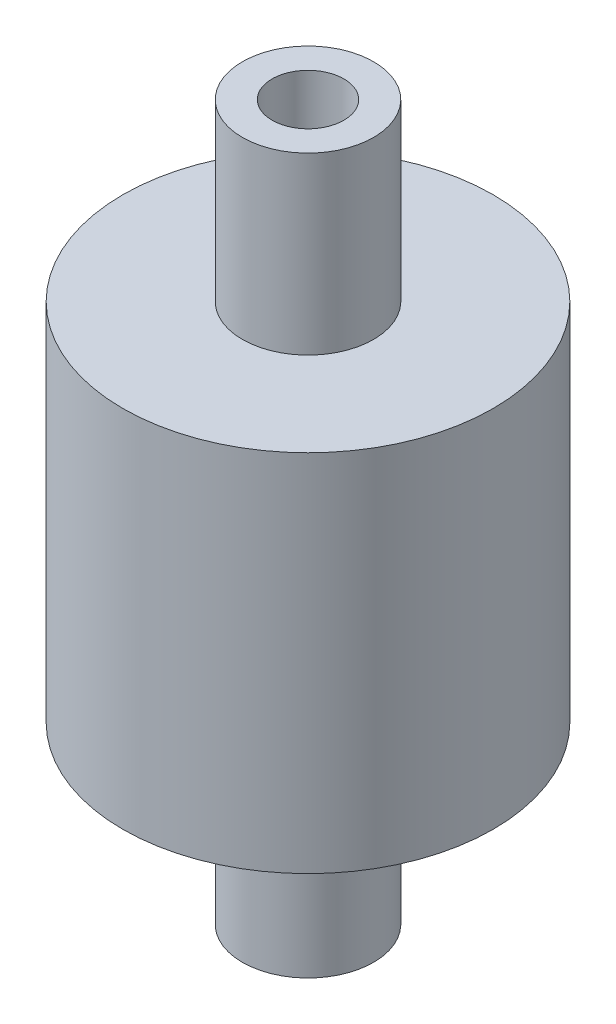
ISO-10303-21;
HEADER;
FILE_DESCRIPTION(('STEP AP214'),'2;1');
FILE_NAME('part.step','',(''),(''),'','','');
FILE_SCHEMA(('AUTOMOTIVE_DESIGN { 1 0 10303 214 1 1 1 1 }'));
ENDSEC;
DATA;
#1=APPLICATION_CONTEXT('core data for automotive mechanical design processes');
#2=APPLICATION_PROTOCOL_DEFINITION('international standard','automotive_design',2000,#1);
#3=PRODUCT_CONTEXT('',#1,'mechanical');
#4=PRODUCT('Part','Part','',(#3));
#5=PRODUCT_RELATED_PRODUCT_CATEGORY('part','',(#4));
#6=PRODUCT_DEFINITION_FORMATION('','',#4);
#7=PRODUCT_DEFINITION_CONTEXT('part definition',#1,'design');
#8=PRODUCT_DEFINITION('design','',#6,#7);
#9=PRODUCT_DEFINITION_SHAPE('','',#8);
#10=(LENGTH_UNIT() NAMED_UNIT(*) SI_UNIT(.MILLI.,.METRE.));
#11=(NAMED_UNIT(*) PLANE_ANGLE_UNIT() SI_UNIT($,.RADIAN.));
#12=(NAMED_UNIT(*) SI_UNIT($,.STERADIAN.) SOLID_ANGLE_UNIT());
#13=UNCERTAINTY_MEASURE_WITH_UNIT(LENGTH_MEASURE(1.E-05),#10,'distance_accuracy_value','');
#14=(GEOMETRIC_REPRESENTATION_CONTEXT(3) GLOBAL_UNCERTAINTY_ASSIGNED_CONTEXT((#13)) GLOBAL_UNIT_ASSIGNED_CONTEXT((#10,
#11,#12)) REPRESENTATION_CONTEXT('',''));
#15=CARTESIAN_POINT('',(0.,0.,0.));
#16=DIRECTION('',(0.,0.,1.));
#17=DIRECTION('',(1.,0.,0.));
#18=AXIS2_PLACEMENT_3D('',#15,#16,#17);
#19=CARTESIAN_POINT('',(0.,12.5,0.));
#20=DIRECTION('',(0.,-1.,0.));
#21=DIRECTION('',(0.,0.,-1.));
#22=AXIS2_PLACEMENT_3D('',#19,#20,#21);
#23=CYLINDRICAL_SURFACE('',#22,12.7);
#24=CARTESIAN_POINT('',(0.,12.5,0.));
#25=DIRECTION('',(0.,1.,0.));
#26=DIRECTION('',(0.,0.,1.));
#27=AXIS2_PLACEMENT_3D('',#24,#25,#26);
#28=CIRCLE('',#27,12.7);
#29=CARTESIAN_POINT('',(0.,12.5,12.7));
#30=VERTEX_POINT('',#29);
#31=EDGE_CURVE('E37',#30,#30,#28,.T.);
#32=ORIENTED_EDGE('',*,*,#31,.F.);
#33=EDGE_LOOP('',(#32));
#34=FACE_BOUND('',#33,.T.);
#35=CARTESIAN_POINT('',(0.,-12.5,0.));
#36=DIRECTION('',(0.,1.,0.));
#37=DIRECTION('',(0.,0.,1.));
#38=AXIS2_PLACEMENT_3D('',#35,#36,#37);
#39=CIRCLE('',#38,12.7);
#40=CARTESIAN_POINT('',(0.,-12.5,12.7));
#41=VERTEX_POINT('',#40);
#42=EDGE_CURVE('E41',#41,#41,#39,.T.);
#43=ORIENTED_EDGE('',*,*,#42,.T.);
#44=EDGE_LOOP('',(#43));
#45=FACE_BOUND('',#44,.T.);
#46=ADVANCED_FACE('F31',(#34,#45),#23,.T.);
#47=CARTESIAN_POINT('',(0.,12.5,0.));
#48=DIRECTION('',(0.,1.,0.));
#49=DIRECTION('',(0.,0.,1.));
#50=AXIS2_PLACEMENT_3D('',#47,#48,#49);
#51=PLANE('',#50);
#52=CARTESIAN_POINT('',(0.,12.5,0.));
#53=DIRECTION('',(0.,1.,0.));
#54=DIRECTION('',(0.,0.,1.));
#55=AXIS2_PLACEMENT_3D('',#52,#53,#54);
#56=CIRCLE('',#55,4.5);
#57=CARTESIAN_POINT('',(0.,12.5,4.5));
#58=VERTEX_POINT('',#57);
#59=EDGE_CURVE('E46',#58,#58,#56,.F.);
#60=ORIENTED_EDGE('',*,*,#59,.T.);
#61=EDGE_LOOP('',(#60));
#62=FACE_BOUND('',#61,.T.);
#63=ORIENTED_EDGE('',*,*,#31,.T.);
#64=EDGE_LOOP('',(#63));
#65=FACE_BOUND('',#64,.T.);
#66=ADVANCED_FACE('F85',(#62,#65),#51,.T.);
#67=CARTESIAN_POINT('',(0.,-12.5,0.));
#68=DIRECTION('',(0.,1.,0.));
#69=DIRECTION('',(0.,0.,1.));
#70=AXIS2_PLACEMENT_3D('',#67,#68,#69);
#71=PLANE('',#70);
#72=CARTESIAN_POINT('',(0.,-12.5,0.));
#73=DIRECTION('',(0.,1.,0.));
#74=DIRECTION('',(0.,0.,1.));
#75=AXIS2_PLACEMENT_3D('',#72,#73,#74);
#76=CIRCLE('',#75,4.5);
#77=CARTESIAN_POINT('',(0.,-12.5,4.5));
#78=VERTEX_POINT('',#77);
#79=EDGE_CURVE('E10',#78,#78,#76,.F.);
#80=ORIENTED_EDGE('',*,*,#79,.F.);
#81=EDGE_LOOP('',(#80));
#82=FACE_BOUND('',#81,.T.);
#83=ORIENTED_EDGE('',*,*,#42,.F.);
#84=EDGE_LOOP('',(#83));
#85=FACE_BOUND('',#84,.T.);
#86=ADVANCED_FACE('F90',(#82,#85),#71,.F.);
#87=CARTESIAN_POINT('',(0.,-24.5,0.));
#88=DIRECTION('',(0.,1.,0.));
#89=DIRECTION('',(0.,0.,1.));
#90=AXIS2_PLACEMENT_3D('',#87,#88,#89);
#91=PLANE('',#90);
#92=CARTESIAN_POINT('',(0.,-24.5,0.));
#93=DIRECTION('',(0.,1.,0.));
#94=DIRECTION('',(0.,0.,1.));
#95=AXIS2_PLACEMENT_3D('',#92,#93,#94);
#96=CIRCLE('',#95,2.46071596348906);
#97=CARTESIAN_POINT('',(0.,-24.5,2.46071596348906));
#98=VERTEX_POINT('',#97);
#99=EDGE_CURVE('E54',#98,#98,#96,.T.);
#100=ORIENTED_EDGE('',*,*,#99,.T.);
#101=EDGE_LOOP('',(#100));
#102=FACE_BOUND('',#101,.T.);
#103=CARTESIAN_POINT('',(0.,-24.5,0.));
#104=DIRECTION('',(0.,1.,0.));
#105=DIRECTION('',(0.,0.,1.));
#106=AXIS2_PLACEMENT_3D('',#103,#104,#105);
#107=CIRCLE('',#106,4.5);
#108=CARTESIAN_POINT('',(0.,-24.5,4.5));
#109=VERTEX_POINT('',#108);
#110=EDGE_CURVE('E51',#109,#109,#107,.T.);
#111=ORIENTED_EDGE('',*,*,#110,.F.);
#112=EDGE_LOOP('',(#111));
#113=FACE_BOUND('',#112,.T.);
#114=ADVANCED_FACE('F79',(#102,#113),#91,.F.);
#115=CARTESIAN_POINT('',(0.,24.5,0.));
#116=DIRECTION('',(0.,-1.,0.));
#117=DIRECTION('',(0.,0.,-1.));
#118=AXIS2_PLACEMENT_3D('',#115,#116,#117);
#119=CYLINDRICAL_SURFACE('',#118,4.5);
#120=ORIENTED_EDGE('',*,*,#110,.T.);
#121=EDGE_LOOP('',(#120));
#122=FACE_BOUND('',#121,.T.);
#123=ORIENTED_EDGE('',*,*,#79,.T.);
#124=EDGE_LOOP('',(#123));
#125=FACE_BOUND('',#124,.T.);
#126=ADVANCED_FACE('F73',(#122,#125),#119,.T.);
#127=ORIENTED_EDGE('',*,*,#59,.F.);
#128=EDGE_LOOP('',(#127));
#129=FACE_BOUND('',#128,.T.);
#130=CARTESIAN_POINT('',(0.,24.5,0.));
#131=DIRECTION('',(0.,1.,0.));
#132=DIRECTION('',(0.,0.,1.));
#133=AXIS2_PLACEMENT_3D('',#130,#131,#132);
#134=CIRCLE('',#133,4.5);
#135=CARTESIAN_POINT('',(0.,24.5,4.5));
#136=VERTEX_POINT('',#135);
#137=EDGE_CURVE('E50',#136,#136,#134,.T.);
#138=ORIENTED_EDGE('',*,*,#137,.F.);
#139=EDGE_LOOP('',(#138));
#140=FACE_BOUND('',#139,.T.);
#141=ADVANCED_FACE('F68',(#129,#140),#119,.T.);
#142=CARTESIAN_POINT('',(0.,24.5,0.));
#143=DIRECTION('',(0.,1.,0.));
#144=DIRECTION('',(0.,0.,1.));
#145=AXIS2_PLACEMENT_3D('',#142,#143,#144);
#146=PLANE('',#145);
#147=CARTESIAN_POINT('',(0.,24.5,0.));
#148=DIRECTION('',(0.,1.,0.));
#149=DIRECTION('',(0.,0.,1.));
#150=AXIS2_PLACEMENT_3D('',#147,#148,#149);
#151=CIRCLE('',#150,2.46071596348906);
#152=CARTESIAN_POINT('',(0.,24.5,2.46071596348906));
#153=VERTEX_POINT('',#152);
#154=EDGE_CURVE('E59',#153,#153,#151,.T.);
#155=ORIENTED_EDGE('',*,*,#154,.F.);
#156=EDGE_LOOP('',(#155));
#157=FACE_BOUND('',#156,.T.);
#158=ORIENTED_EDGE('',*,*,#137,.T.);
#159=EDGE_LOOP('',(#158));
#160=FACE_BOUND('',#159,.T.);
#161=ADVANCED_FACE('F65',(#157,#160),#146,.T.);
#162=CARTESIAN_POINT('',(0.,-24.5,0.));
#163=DIRECTION('',(0.,1.,0.));
#164=DIRECTION('',(0.,0.,1.));
#165=AXIS2_PLACEMENT_3D('',#162,#163,#164);
#166=CYLINDRICAL_SURFACE('',#165,2.46071596348906);
#167=ORIENTED_EDGE('',*,*,#99,.F.);
#168=EDGE_LOOP('',(#167));
#169=FACE_BOUND('',#168,.T.);
#170=ORIENTED_EDGE('',*,*,#154,.T.);
#171=EDGE_LOOP('',(#170));
#172=FACE_BOUND('',#171,.T.);
#173=ADVANCED_FACE('F63',(#169,#172),#166,.F.);
#174=CLOSED_SHELL('',(#46,#66,#86,#114,#126,#141,#161,#173));
#175=MANIFOLD_SOLID_BREP('B2',#174);
#176=ADVANCED_BREP_SHAPE_REPRESENTATION('',(#18,#175),#14);
#177=SHAPE_DEFINITION_REPRESENTATION(#9,#176);
ENDSEC;
END-ISO-10303-21;
